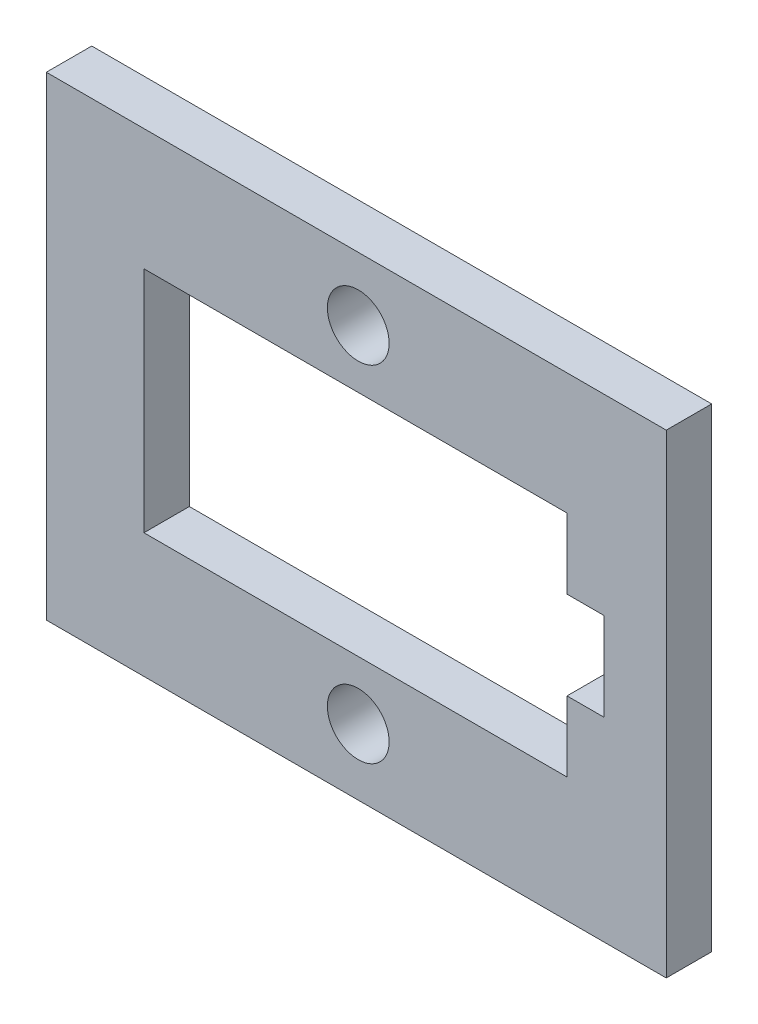
ISO-10303-21;
HEADER;
FILE_DESCRIPTION(('STEP AP214'),'2;1');
FILE_NAME('part.step','',(''),(''),'','','');
FILE_SCHEMA(('AUTOMOTIVE_DESIGN { 1 0 10303 214 1 1 1 1 }'));
ENDSEC;
DATA;
#1=APPLICATION_CONTEXT('core data for automotive mechanical design processes');
#2=APPLICATION_PROTOCOL_DEFINITION('international standard','automotive_design',2000,#1);
#3=PRODUCT_CONTEXT('',#1,'mechanical');
#4=PRODUCT('Part','Part','',(#3));
#5=PRODUCT_RELATED_PRODUCT_CATEGORY('part','',(#4));
#6=PRODUCT_DEFINITION_FORMATION('','',#4);
#7=PRODUCT_DEFINITION_CONTEXT('part definition',#1,'design');
#8=PRODUCT_DEFINITION('design','',#6,#7);
#9=PRODUCT_DEFINITION_SHAPE('','',#8);
#10=(LENGTH_UNIT() NAMED_UNIT(*) SI_UNIT(.MILLI.,.METRE.));
#11=(NAMED_UNIT(*) PLANE_ANGLE_UNIT() SI_UNIT($,.RADIAN.));
#12=(NAMED_UNIT(*) SI_UNIT($,.STERADIAN.) SOLID_ANGLE_UNIT());
#13=UNCERTAINTY_MEASURE_WITH_UNIT(LENGTH_MEASURE(1.E-05),#10,'distance_accuracy_value','');
#14=(GEOMETRIC_REPRESENTATION_CONTEXT(3) GLOBAL_UNCERTAINTY_ASSIGNED_CONTEXT((#13)) GLOBAL_UNIT_ASSIGNED_CONTEXT((#10,
#11,#12)) REPRESENTATION_CONTEXT('',''));
#15=CARTESIAN_POINT('',(0.,0.,0.));
#16=DIRECTION('',(0.,0.,1.));
#17=DIRECTION('',(1.,0.,0.));
#18=AXIS2_PLACEMENT_3D('',#15,#16,#17);
#19=CARTESIAN_POINT('',(0.,0.,2.5));
#20=DIRECTION('',(0.,0.,-1.));
#21=DIRECTION('',(-1.,0.,0.));
#22=AXIS2_PLACEMENT_3D('',#19,#20,#21);
#23=PLANE('',#22);
#24=DIRECTION('',(0.,1.,0.));
#25=VECTOR('',#24,1.);
#26=CARTESIAN_POINT('',(34.1244277954102,26.1177336679482,2.5));
#27=LINE('',#26,#25);
#28=CARTESIAN_POINT('',(34.1244277954102,0.,2.5));
#29=VERTEX_POINT('',#28);
#30=CARTESIAN_POINT('',(34.1244277954102,26.1177336679482,2.5));
#31=VERTEX_POINT('',#30);
#32=EDGE_CURVE('E221',#29,#31,#27,.T.);
#33=ORIENTED_EDGE('',*,*,#32,.T.);
#34=DIRECTION('',(-1.,0.,0.));
#35=VECTOR('',#34,1.);
#36=CARTESIAN_POINT('',(34.1244277954102,26.1177336679482,2.5));
#37=LINE('',#36,#35);
#38=CARTESIAN_POINT('',(0.,26.1177336679482,2.5));
#39=VERTEX_POINT('',#38);
#40=EDGE_CURVE('E225',#31,#39,#37,.T.);
#41=ORIENTED_EDGE('',*,*,#40,.T.);
#42=DIRECTION('',(0.,-1.,0.));
#43=VECTOR('',#42,1.);
#44=CARTESIAN_POINT('',(0.,26.1177336679482,2.5));
#45=LINE('',#44,#43);
#46=CARTESIAN_POINT('',(0.,0.,2.5));
#47=VERTEX_POINT('',#46);
#48=EDGE_CURVE('E229',#39,#47,#45,.T.);
#49=ORIENTED_EDGE('',*,*,#48,.T.);
#50=DIRECTION('',(1.,0.,0.));
#51=VECTOR('',#50,1.);
#52=CARTESIAN_POINT('',(34.1244277954102,0.,2.5));
#53=LINE('',#52,#51);
#54=EDGE_CURVE('E232',#47,#29,#53,.T.);
#55=ORIENTED_EDGE('',*,*,#54,.T.);
#56=EDGE_LOOP('',(#33,#41,#49,#55));
#57=FACE_BOUND('',#56,.T.);
#58=DIRECTION('',(0.,1.,0.));
#59=VECTOR('',#58,1.);
#60=CARTESIAN_POINT('',(30.6840327241066,10.7174663678863,2.5));
#61=LINE('',#60,#59);
#62=CARTESIAN_POINT('',(30.6840327241066,10.7174663678863,2.5));
#63=VERTEX_POINT('',#62);
#64=CARTESIAN_POINT('',(30.6840327241066,15.5672558878137,2.5));
#65=VERTEX_POINT('',#64);
#66=EDGE_CURVE('E129',#63,#65,#61,.T.);
#67=ORIENTED_EDGE('',*,*,#66,.F.);
#68=DIRECTION('',(1.,0.,0.));
#69=VECTOR('',#68,1.);
#70=CARTESIAN_POINT('',(28.6620813737904,10.7174663678863,2.5));
#71=LINE('',#70,#69);
#72=CARTESIAN_POINT('',(28.6620813737904,10.7174663678863,2.5));
#73=VERTEX_POINT('',#72);
#74=EDGE_CURVE('E172',#73,#63,#71,.T.);
#75=ORIENTED_EDGE('',*,*,#74,.F.);
#76=DIRECTION('',(0.,1.,0.));
#77=VECTOR('',#76,1.);
#78=CARTESIAN_POINT('',(28.6620813737904,6.85001851781833,2.5));
#79=LINE('',#78,#77);
#80=CARTESIAN_POINT('',(28.6620813737904,6.85001851781833,2.5));
#81=VERTEX_POINT('',#80);
#82=EDGE_CURVE('E169',#81,#73,#79,.T.);
#83=ORIENTED_EDGE('',*,*,#82,.F.);
#84=DIRECTION('',(1.,0.,0.));
#85=VECTOR('',#84,1.);
#86=CARTESIAN_POINT('',(5.37249235660638,6.85001851781833,2.5));
#87=LINE('',#86,#85);
#88=CARTESIAN_POINT('',(5.37249235660638,6.85001851781833,2.5));
#89=VERTEX_POINT('',#88);
#90=EDGE_CURVE('E166',#89,#81,#87,.T.);
#91=ORIENTED_EDGE('',*,*,#90,.F.);
#92=DIRECTION('',(0.,-1.,0.));
#93=VECTOR('',#92,1.);
#94=CARTESIAN_POINT('',(5.37249235660638,19.4347037378816,2.5));
#95=LINE('',#94,#93);
#96=CARTESIAN_POINT('',(5.37249235660638,19.4347037378816,2.5));
#97=VERTEX_POINT('',#96);
#98=EDGE_CURVE('E163',#97,#89,#95,.T.);
#99=ORIENTED_EDGE('',*,*,#98,.F.);
#100=DIRECTION('',(-1.,0.,0.));
#101=VECTOR('',#100,1.);
#102=CARTESIAN_POINT('',(28.6620813737904,19.4347037378816,2.5));
#103=LINE('',#102,#101);
#104=CARTESIAN_POINT('',(28.6620813737904,19.4347037378816,2.5));
#105=VERTEX_POINT('',#104);
#106=EDGE_CURVE('E157',#105,#97,#103,.T.);
#107=ORIENTED_EDGE('',*,*,#106,.F.);
#108=DIRECTION('',(0.,1.,0.));
#109=VECTOR('',#108,1.);
#110=CARTESIAN_POINT('',(28.6620813737904,15.5672558878137,2.5));
#111=LINE('',#110,#109);
#112=CARTESIAN_POINT('',(28.6620813737904,15.5672558878137,2.5));
#113=VERTEX_POINT('',#112);
#114=EDGE_CURVE('E153',#113,#105,#111,.T.);
#115=ORIENTED_EDGE('',*,*,#114,.F.);
#116=DIRECTION('',(-1.,0.,0.));
#117=VECTOR('',#116,1.);
#118=CARTESIAN_POINT('',(30.6840327241066,15.5672558878137,2.5));
#119=LINE('',#118,#117);
#120=EDGE_CURVE('E138',#65,#113,#119,.T.);
#121=ORIENTED_EDGE('',*,*,#120,.F.);
#122=EDGE_LOOP('',(#67,#75,#83,#91,#99,#107,#115,#121));
#123=FACE_BOUND('',#122,.T.);
#124=CARTESIAN_POINT('',(17.1700015068054,3.63000059073294,2.5));
#125=DIRECTION('',(0.,0.,1.));
#126=DIRECTION('',(1.,0.,0.));
#127=AXIS2_PLACEMENT_3D('',#124,#125,#126);
#128=CIRCLE('',#127,1.7000004402056);
#129=CARTESIAN_POINT('',(18.870001947011,3.63000059073294,2.5));
#130=VERTEX_POINT('',#129);
#131=EDGE_CURVE('E177',#130,#130,#128,.T.);
#132=ORIENTED_EDGE('',*,*,#131,.F.);
#133=EDGE_LOOP('',(#132));
#134=FACE_BOUND('',#133,.T.);
#135=CARTESIAN_POINT('',(17.1700003990823,22.6300127758605,2.5));
#136=DIRECTION('',(0.,0.,1.));
#137=DIRECTION('',(1.,0.,0.));
#138=AXIS2_PLACEMENT_3D('',#135,#136,#137);
#139=CIRCLE('',#138,1.7000004402056);
#140=CARTESIAN_POINT('',(18.8700008392879,22.6300127758605,2.5));
#141=VERTEX_POINT('',#140);
#142=EDGE_CURVE('E337',#141,#141,#139,.T.);
#143=ORIENTED_EDGE('',*,*,#142,.F.);
#144=EDGE_LOOP('',(#143));
#145=FACE_BOUND('',#144,.T.);
#146=ADVANCED_FACE('F39',(#57,#123,#134,#145),#23,.F.);
#147=CARTESIAN_POINT('',(0.,0.,0.));
#148=DIRECTION('',(0.,0.,-1.));
#149=DIRECTION('',(-1.,0.,0.));
#150=AXIS2_PLACEMENT_3D('',#147,#148,#149);
#151=PLANE('',#150);
#152=CARTESIAN_POINT('',(17.1700015068054,3.63000059073294,0.));
#153=DIRECTION('',(0.,0.,1.));
#154=DIRECTION('',(1.,0.,0.));
#155=AXIS2_PLACEMENT_3D('',#152,#153,#154);
#156=CIRCLE('',#155,1.7000004402056);
#157=CARTESIAN_POINT('',(18.870001947011,3.63000059073294,0.));
#158=VERTEX_POINT('',#157);
#159=EDGE_CURVE('E345',#158,#158,#156,.T.);
#160=ORIENTED_EDGE('',*,*,#159,.T.);
#161=EDGE_LOOP('',(#160));
#162=FACE_BOUND('',#161,.T.);
#163=DIRECTION('',(0.,1.,0.));
#164=VECTOR('',#163,1.);
#165=CARTESIAN_POINT('',(34.1244277954102,26.1177336679482,0.));
#166=LINE('',#165,#164);
#167=CARTESIAN_POINT('',(34.1244277954102,0.,0.));
#168=VERTEX_POINT('',#167);
#169=CARTESIAN_POINT('',(34.1244277954102,26.1177336679482,0.));
#170=VERTEX_POINT('',#169);
#171=EDGE_CURVE('E147',#168,#170,#166,.T.);
#172=ORIENTED_EDGE('',*,*,#171,.F.);
#173=DIRECTION('',(1.,0.,0.));
#174=VECTOR('',#173,1.);
#175=CARTESIAN_POINT('',(34.1244277954102,0.,0.));
#176=LINE('',#175,#174);
#177=CARTESIAN_POINT('',(0.,0.,0.));
#178=VERTEX_POINT('',#177);
#179=EDGE_CURVE('E226',#178,#168,#176,.T.);
#180=ORIENTED_EDGE('',*,*,#179,.F.);
#181=DIRECTION('',(0.,-1.,0.));
#182=VECTOR('',#181,1.);
#183=CARTESIAN_POINT('',(0.,26.1177336679482,0.));
#184=LINE('',#183,#182);
#185=CARTESIAN_POINT('',(0.,26.1177336679482,0.));
#186=VERTEX_POINT('',#185);
#187=EDGE_CURVE('E242',#186,#178,#184,.T.);
#188=ORIENTED_EDGE('',*,*,#187,.F.);
#189=DIRECTION('',(-1.,0.,0.));
#190=VECTOR('',#189,1.);
#191=CARTESIAN_POINT('',(34.1244277954102,26.1177336679482,0.));
#192=LINE('',#191,#190);
#193=EDGE_CURVE('E239',#170,#186,#192,.T.);
#194=ORIENTED_EDGE('',*,*,#193,.F.);
#195=EDGE_LOOP('',(#172,#180,#188,#194));
#196=FACE_BOUND('',#195,.T.);
#197=DIRECTION('',(1.,0.,0.));
#198=VECTOR('',#197,1.);
#199=CARTESIAN_POINT('',(28.6620813737904,10.7174663678863,0.));
#200=LINE('',#199,#198);
#201=CARTESIAN_POINT('',(28.6620813737904,10.7174663678863,0.));
#202=VERTEX_POINT('',#201);
#203=CARTESIAN_POINT('',(30.6840327241066,10.7174663678863,0.));
#204=VERTEX_POINT('',#203);
#205=EDGE_CURVE('E139',#202,#204,#200,.T.);
#206=ORIENTED_EDGE('',*,*,#205,.T.);
#207=DIRECTION('',(0.,1.,0.));
#208=VECTOR('',#207,1.);
#209=CARTESIAN_POINT('',(30.6840327241066,10.7174663678863,0.));
#210=LINE('',#209,#208);
#211=CARTESIAN_POINT('',(30.6840327241066,15.5672558878137,0.));
#212=VERTEX_POINT('',#211);
#213=EDGE_CURVE('E63',#204,#212,#210,.T.);
#214=ORIENTED_EDGE('',*,*,#213,.T.);
#215=DIRECTION('',(-1.,0.,0.));
#216=VECTOR('',#215,1.);
#217=CARTESIAN_POINT('',(30.6840327241066,15.5672558878137,0.));
#218=LINE('',#217,#216);
#219=CARTESIAN_POINT('',(28.6620813737904,15.5672558878137,0.));
#220=VERTEX_POINT('',#219);
#221=EDGE_CURVE('E145',#212,#220,#218,.T.);
#222=ORIENTED_EDGE('',*,*,#221,.T.);
#223=DIRECTION('',(0.,1.,0.));
#224=VECTOR('',#223,1.);
#225=CARTESIAN_POINT('',(28.6620813737904,15.5672558878137,0.));
#226=LINE('',#225,#224);
#227=CARTESIAN_POINT('',(28.6620813737904,19.4347037378816,0.));
#228=VERTEX_POINT('',#227);
#229=EDGE_CURVE('E180',#220,#228,#226,.T.);
#230=ORIENTED_EDGE('',*,*,#229,.T.);
#231=DIRECTION('',(-1.,0.,0.));
#232=VECTOR('',#231,1.);
#233=CARTESIAN_POINT('',(28.6620813737904,19.4347037378816,0.));
#234=LINE('',#233,#232);
#235=CARTESIAN_POINT('',(5.37249235660638,19.4347037378816,0.));
#236=VERTEX_POINT('',#235);
#237=EDGE_CURVE('E184',#228,#236,#234,.T.);
#238=ORIENTED_EDGE('',*,*,#237,.T.);
#239=DIRECTION('',(0.,-1.,0.));
#240=VECTOR('',#239,1.);
#241=CARTESIAN_POINT('',(5.37249235660638,19.4347037378816,0.));
#242=LINE('',#241,#240);
#243=CARTESIAN_POINT('',(5.37249235660638,6.85001851781833,0.));
#244=VERTEX_POINT('',#243);
#245=EDGE_CURVE('E188',#236,#244,#242,.T.);
#246=ORIENTED_EDGE('',*,*,#245,.T.);
#247=DIRECTION('',(1.,0.,0.));
#248=VECTOR('',#247,1.);
#249=CARTESIAN_POINT('',(5.37249235660638,6.85001851781833,0.));
#250=LINE('',#249,#248);
#251=CARTESIAN_POINT('',(28.6620813737904,6.85001851781833,0.));
#252=VERTEX_POINT('',#251);
#253=EDGE_CURVE('E192',#244,#252,#250,.T.);
#254=ORIENTED_EDGE('',*,*,#253,.T.);
#255=DIRECTION('',(0.,1.,0.));
#256=VECTOR('',#255,1.);
#257=CARTESIAN_POINT('',(28.6620813737904,6.85001851781833,0.));
#258=LINE('',#257,#256);
#259=EDGE_CURVE('E196',#252,#202,#258,.T.);
#260=ORIENTED_EDGE('',*,*,#259,.T.);
#261=EDGE_LOOP('',(#206,#214,#222,#230,#238,#246,#254,#260));
#262=FACE_BOUND('',#261,.T.);
#263=CARTESIAN_POINT('',(17.1700003990823,22.6300127758605,0.));
#264=DIRECTION('',(0.,0.,1.));
#265=DIRECTION('',(1.,0.,0.));
#266=AXIS2_PLACEMENT_3D('',#263,#264,#265);
#267=CIRCLE('',#266,1.7000004402056);
#268=CARTESIAN_POINT('',(18.8700008392879,22.6300127758605,0.));
#269=VERTEX_POINT('',#268);
#270=EDGE_CURVE('E340',#269,#269,#267,.T.);
#271=ORIENTED_EDGE('',*,*,#270,.T.);
#272=EDGE_LOOP('',(#271));
#273=FACE_BOUND('',#272,.T.);
#274=ADVANCED_FACE('F265',(#162,#196,#262,#273),#151,.T.);
#275=CARTESIAN_POINT('',(34.1244277954102,26.1177336679482,2.5));
#276=DIRECTION('',(-1.,0.,0.));
#277=DIRECTION('',(0.,0.,1.));
#278=AXIS2_PLACEMENT_3D('',#275,#276,#277);
#279=PLANE('',#278);
#280=ORIENTED_EDGE('',*,*,#171,.T.);
#281=DIRECTION('',(0.,0.,-1.));
#282=VECTOR('',#281,1.);
#283=CARTESIAN_POINT('',(34.1244277954102,26.1177336679482,2.5));
#284=LINE('',#283,#282);
#285=EDGE_CURVE('E11',#31,#170,#284,.T.);
#286=ORIENTED_EDGE('',*,*,#285,.F.);
#287=ORIENTED_EDGE('',*,*,#32,.F.);
#288=DIRECTION('',(0.,0.,-1.));
#289=VECTOR('',#288,1.);
#290=CARTESIAN_POINT('',(34.1244277954102,0.,2.5));
#291=LINE('',#290,#289);
#292=EDGE_CURVE('E235',#29,#168,#291,.T.);
#293=ORIENTED_EDGE('',*,*,#292,.T.);
#294=EDGE_LOOP('',(#280,#286,#287,#293));
#295=FACE_BOUND('',#294,.T.);
#296=ADVANCED_FACE('F41',(#295),#279,.F.);
#297=CARTESIAN_POINT('',(34.1244277954102,26.1177336679482,2.5));
#298=DIRECTION('',(0.,-1.,0.));
#299=DIRECTION('',(1.,0.,0.));
#300=AXIS2_PLACEMENT_3D('',#297,#298,#299);
#301=PLANE('',#300);
#302=ORIENTED_EDGE('',*,*,#193,.T.);
#303=DIRECTION('',(0.,0.,-1.));
#304=VECTOR('',#303,1.);
#305=CARTESIAN_POINT('',(0.,26.1177336679482,2.5));
#306=LINE('',#305,#304);
#307=EDGE_CURVE('E48',#39,#186,#306,.T.);
#308=ORIENTED_EDGE('',*,*,#307,.F.);
#309=ORIENTED_EDGE('',*,*,#40,.F.);
#310=ORIENTED_EDGE('',*,*,#285,.T.);
#311=EDGE_LOOP('',(#302,#308,#309,#310));
#312=FACE_BOUND('',#311,.T.);
#313=ADVANCED_FACE('F275',(#312),#301,.F.);
#314=CARTESIAN_POINT('',(0.,26.1177336679482,2.5));
#315=DIRECTION('',(1.,0.,0.));
#316=DIRECTION('',(0.,0.,-1.));
#317=AXIS2_PLACEMENT_3D('',#314,#315,#316);
#318=PLANE('',#317);
#319=ORIENTED_EDGE('',*,*,#187,.T.);
#320=DIRECTION('',(0.,0.,-1.));
#321=VECTOR('',#320,1.);
#322=CARTESIAN_POINT('',(0.,0.,2.5));
#323=LINE('',#322,#321);
#324=EDGE_CURVE('E250',#47,#178,#323,.T.);
#325=ORIENTED_EDGE('',*,*,#324,.F.);
#326=ORIENTED_EDGE('',*,*,#48,.F.);
#327=ORIENTED_EDGE('',*,*,#307,.T.);
#328=EDGE_LOOP('',(#319,#325,#326,#327));
#329=FACE_BOUND('',#328,.T.);
#330=ADVANCED_FACE('F259',(#329),#318,.F.);
#331=CARTESIAN_POINT('',(34.1244277954102,0.,2.5));
#332=DIRECTION('',(0.,1.,0.));
#333=DIRECTION('',(0.,0.,1.));
#334=AXIS2_PLACEMENT_3D('',#331,#332,#333);
#335=PLANE('',#334);
#336=ORIENTED_EDGE('',*,*,#179,.T.);
#337=ORIENTED_EDGE('',*,*,#292,.F.);
#338=ORIENTED_EDGE('',*,*,#54,.F.);
#339=ORIENTED_EDGE('',*,*,#324,.T.);
#340=EDGE_LOOP('',(#336,#337,#338,#339));
#341=FACE_BOUND('',#340,.T.);
#342=ADVANCED_FACE('F269',(#341),#335,.F.);
#343=CARTESIAN_POINT('',(30.6840327241066,10.7174663678863,2.5));
#344=DIRECTION('',(-1.,0.,0.));
#345=DIRECTION('',(0.,0.,1.));
#346=AXIS2_PLACEMENT_3D('',#343,#344,#345);
#347=PLANE('',#346);
#348=ORIENTED_EDGE('',*,*,#213,.F.);
#349=DIRECTION('',(0.,0.,-1.));
#350=VECTOR('',#349,1.);
#351=CARTESIAN_POINT('',(30.6840327241066,10.7174663678863,2.5));
#352=LINE('',#351,#350);
#353=EDGE_CURVE('E133',#63,#204,#352,.T.);
#354=ORIENTED_EDGE('',*,*,#353,.F.);
#355=ORIENTED_EDGE('',*,*,#66,.T.);
#356=DIRECTION('',(0.,0.,-1.));
#357=VECTOR('',#356,1.);
#358=CARTESIAN_POINT('',(30.6840327241066,15.5672558878137,2.5));
#359=LINE('',#358,#357);
#360=EDGE_CURVE('E132',#65,#212,#359,.T.);
#361=ORIENTED_EDGE('',*,*,#360,.T.);
#362=EDGE_LOOP('',(#348,#354,#355,#361));
#363=FACE_BOUND('',#362,.T.);
#364=ADVANCED_FACE('F131',(#363),#347,.T.);
#365=CARTESIAN_POINT('',(30.6840327241066,15.5672558878137,2.5));
#366=DIRECTION('',(0.,-1.,0.));
#367=DIRECTION('',(0.,0.,-1.));
#368=AXIS2_PLACEMENT_3D('',#365,#366,#367);
#369=PLANE('',#368);
#370=ORIENTED_EDGE('',*,*,#221,.F.);
#371=ORIENTED_EDGE('',*,*,#360,.F.);
#372=ORIENTED_EDGE('',*,*,#120,.T.);
#373=DIRECTION('',(0.,0.,-1.));
#374=VECTOR('',#373,1.);
#375=CARTESIAN_POINT('',(28.6620813737904,15.5672558878137,2.5));
#376=LINE('',#375,#374);
#377=EDGE_CURVE('E148',#113,#220,#376,.T.);
#378=ORIENTED_EDGE('',*,*,#377,.T.);
#379=EDGE_LOOP('',(#370,#371,#372,#378));
#380=FACE_BOUND('',#379,.T.);
#381=ADVANCED_FACE('F142',(#380),#369,.T.);
#382=CARTESIAN_POINT('',(28.6620813737904,15.5672558878137,2.5));
#383=DIRECTION('',(-1.,0.,0.));
#384=DIRECTION('',(0.,0.,1.));
#385=AXIS2_PLACEMENT_3D('',#382,#383,#384);
#386=PLANE('',#385);
#387=ORIENTED_EDGE('',*,*,#229,.F.);
#388=ORIENTED_EDGE('',*,*,#377,.F.);
#389=ORIENTED_EDGE('',*,*,#114,.T.);
#390=DIRECTION('',(0.,0.,-1.));
#391=VECTOR('',#390,1.);
#392=CARTESIAN_POINT('',(28.6620813737904,19.4347037378816,2.5));
#393=LINE('',#392,#391);
#394=EDGE_CURVE('E216',#105,#228,#393,.T.);
#395=ORIENTED_EDGE('',*,*,#394,.T.);
#396=EDGE_LOOP('',(#387,#388,#389,#395));
#397=FACE_BOUND('',#396,.T.);
#398=ADVANCED_FACE('F299',(#397),#386,.T.);
#399=CARTESIAN_POINT('',(28.6620813737904,19.4347037378816,2.5));
#400=DIRECTION('',(0.,-1.,0.));
#401=DIRECTION('',(0.,0.,-1.));
#402=AXIS2_PLACEMENT_3D('',#399,#400,#401);
#403=PLANE('',#402);
#404=ORIENTED_EDGE('',*,*,#237,.F.);
#405=ORIENTED_EDGE('',*,*,#394,.F.);
#406=ORIENTED_EDGE('',*,*,#106,.T.);
#407=DIRECTION('',(0.,0.,-1.));
#408=VECTOR('',#407,1.);
#409=CARTESIAN_POINT('',(5.37249235660638,19.4347037378816,2.5));
#410=LINE('',#409,#408);
#411=EDGE_CURVE('E213',#97,#236,#410,.T.);
#412=ORIENTED_EDGE('',*,*,#411,.T.);
#413=EDGE_LOOP('',(#404,#405,#406,#412));
#414=FACE_BOUND('',#413,.T.);
#415=ADVANCED_FACE('F303',(#414),#403,.T.);
#416=CARTESIAN_POINT('',(5.37249235660638,19.4347037378816,2.5));
#417=DIRECTION('',(1.,0.,0.));
#418=DIRECTION('',(0.,0.,-1.));
#419=AXIS2_PLACEMENT_3D('',#416,#417,#418);
#420=PLANE('',#419);
#421=ORIENTED_EDGE('',*,*,#245,.F.);
#422=ORIENTED_EDGE('',*,*,#411,.F.);
#423=ORIENTED_EDGE('',*,*,#98,.T.);
#424=DIRECTION('',(0.,0.,-1.));
#425=VECTOR('',#424,1.);
#426=CARTESIAN_POINT('',(5.37249235660638,6.85001851781833,2.5));
#427=LINE('',#426,#425);
#428=EDGE_CURVE('E210',#89,#244,#427,.T.);
#429=ORIENTED_EDGE('',*,*,#428,.T.);
#430=EDGE_LOOP('',(#421,#422,#423,#429));
#431=FACE_BOUND('',#430,.T.);
#432=ADVANCED_FACE('F309',(#431),#420,.T.);
#433=CARTESIAN_POINT('',(5.37249235660638,6.85001851781833,2.5));
#434=DIRECTION('',(0.,1.,0.));
#435=DIRECTION('',(0.,0.,1.));
#436=AXIS2_PLACEMENT_3D('',#433,#434,#435);
#437=PLANE('',#436);
#438=ORIENTED_EDGE('',*,*,#253,.F.);
#439=ORIENTED_EDGE('',*,*,#428,.F.);
#440=ORIENTED_EDGE('',*,*,#90,.T.);
#441=DIRECTION('',(0.,0.,-1.));
#442=VECTOR('',#441,1.);
#443=CARTESIAN_POINT('',(28.6620813737904,6.85001851781833,2.5));
#444=LINE('',#443,#442);
#445=EDGE_CURVE('E207',#81,#252,#444,.T.);
#446=ORIENTED_EDGE('',*,*,#445,.T.);
#447=EDGE_LOOP('',(#438,#439,#440,#446));
#448=FACE_BOUND('',#447,.T.);
#449=ADVANCED_FACE('F313',(#448),#437,.T.);
#450=CARTESIAN_POINT('',(28.6620813737904,6.85001851781833,2.5));
#451=DIRECTION('',(-1.,0.,0.));
#452=DIRECTION('',(0.,0.,1.));
#453=AXIS2_PLACEMENT_3D('',#450,#451,#452);
#454=PLANE('',#453);
#455=ORIENTED_EDGE('',*,*,#259,.F.);
#456=ORIENTED_EDGE('',*,*,#445,.F.);
#457=ORIENTED_EDGE('',*,*,#82,.T.);
#458=DIRECTION('',(0.,0.,-1.));
#459=VECTOR('',#458,1.);
#460=CARTESIAN_POINT('',(28.6620813737904,10.7174663678863,2.5));
#461=LINE('',#460,#459);
#462=EDGE_CURVE('E55',#73,#202,#461,.T.);
#463=ORIENTED_EDGE('',*,*,#462,.T.);
#464=EDGE_LOOP('',(#455,#456,#457,#463));
#465=FACE_BOUND('',#464,.T.);
#466=ADVANCED_FACE('F317',(#465),#454,.T.);
#467=CARTESIAN_POINT('',(28.6620813737904,10.7174663678863,2.5));
#468=DIRECTION('',(0.,1.,0.));
#469=DIRECTION('',(0.,0.,1.));
#470=AXIS2_PLACEMENT_3D('',#467,#468,#469);
#471=PLANE('',#470);
#472=ORIENTED_EDGE('',*,*,#205,.F.);
#473=ORIENTED_EDGE('',*,*,#462,.F.);
#474=ORIENTED_EDGE('',*,*,#74,.T.);
#475=ORIENTED_EDGE('',*,*,#353,.T.);
#476=EDGE_LOOP('',(#472,#473,#474,#475));
#477=FACE_BOUND('',#476,.T.);
#478=ADVANCED_FACE('F321',(#477),#471,.T.);
#479=CARTESIAN_POINT('',(17.1700015068054,3.63000059073294,2.5));
#480=DIRECTION('',(0.,0.,-1.));
#481=DIRECTION('',(-1.,0.,0.));
#482=AXIS2_PLACEMENT_3D('',#479,#480,#481);
#483=CYLINDRICAL_SURFACE('',#482,1.7000004402056);
#484=ORIENTED_EDGE('',*,*,#131,.T.);
#485=EDGE_LOOP('',(#484));
#486=FACE_BOUND('',#485,.T.);
#487=ORIENTED_EDGE('',*,*,#159,.F.);
#488=EDGE_LOOP('',(#487));
#489=FACE_BOUND('',#488,.T.);
#490=ADVANCED_FACE('F325',(#486,#489),#483,.F.);
#491=CARTESIAN_POINT('',(17.1700003990823,22.6300127758605,2.5));
#492=DIRECTION('',(0.,0.,-1.));
#493=DIRECTION('',(-1.,0.,0.));
#494=AXIS2_PLACEMENT_3D('',#491,#492,#493);
#495=CYLINDRICAL_SURFACE('',#494,1.7000004402056);
#496=ORIENTED_EDGE('',*,*,#142,.T.);
#497=EDGE_LOOP('',(#496));
#498=FACE_BOUND('',#497,.T.);
#499=ORIENTED_EDGE('',*,*,#270,.F.);
#500=EDGE_LOOP('',(#499));
#501=FACE_BOUND('',#500,.T.);
#502=ADVANCED_FACE('F328',(#498,#501),#495,.F.);
#503=CLOSED_SHELL('',(#146,#274,#296,#313,#330,#342,#364,#381,#398,#415,#432,#449,#466,#478,
#490,#502));
#504=MANIFOLD_SOLID_BREP('B2',#503);
#505=ADVANCED_BREP_SHAPE_REPRESENTATION('',(#18,#504),#14);
#506=SHAPE_DEFINITION_REPRESENTATION(#9,#505);
ENDSEC;
END-ISO-10303-21;
